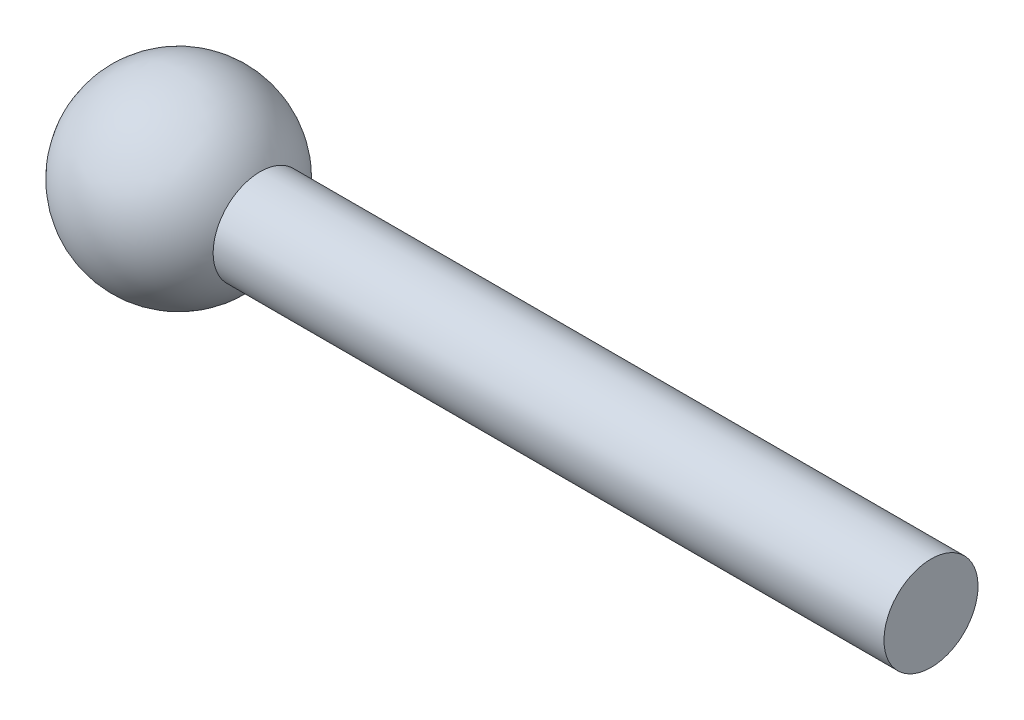
ISO-10303-21;
HEADER;
FILE_DESCRIPTION(('STEP AP214'),'2;1');
FILE_NAME('part.step','',(''),(''),'','','');
FILE_SCHEMA(('AUTOMOTIVE_DESIGN { 1 0 10303 214 1 1 1 1 }'));
ENDSEC;
DATA;
#1=APPLICATION_CONTEXT('core data for automotive mechanical design processes');
#2=APPLICATION_PROTOCOL_DEFINITION('international standard','automotive_design',2000,#1);
#3=PRODUCT_CONTEXT('',#1,'mechanical');
#4=PRODUCT('Part','Part','',(#3));
#5=PRODUCT_RELATED_PRODUCT_CATEGORY('part','',(#4));
#6=PRODUCT_DEFINITION_FORMATION('','',#4);
#7=PRODUCT_DEFINITION_CONTEXT('part definition',#1,'design');
#8=PRODUCT_DEFINITION('design','',#6,#7);
#9=PRODUCT_DEFINITION_SHAPE('','',#8);
#10=(LENGTH_UNIT() NAMED_UNIT(*) SI_UNIT(.MILLI.,.METRE.));
#11=(NAMED_UNIT(*) PLANE_ANGLE_UNIT() SI_UNIT($,.RADIAN.));
#12=(NAMED_UNIT(*) SI_UNIT($,.STERADIAN.) SOLID_ANGLE_UNIT());
#13=UNCERTAINTY_MEASURE_WITH_UNIT(LENGTH_MEASURE(1.E-05),#10,'distance_accuracy_value','');
#14=(GEOMETRIC_REPRESENTATION_CONTEXT(3) GLOBAL_UNCERTAINTY_ASSIGNED_CONTEXT((#13)) GLOBAL_UNIT_ASSIGNED_CONTEXT((#10,
#11,#12)) REPRESENTATION_CONTEXT('',''));
#15=CARTESIAN_POINT('',(0.,0.,0.));
#16=DIRECTION('',(0.,0.,1.));
#17=DIRECTION('',(1.,0.,0.));
#18=AXIS2_PLACEMENT_3D('',#15,#16,#17);
#19=CARTESIAN_POINT('',(0.,0.,0.));
#20=DIRECTION('',(-1.,0.,0.));
#21=DIRECTION('',(0.,-1.,0.));
#22=AXIS2_PLACEMENT_3D('',#19,#20,#21);
#23=PLANE('',#22);
#24=CARTESIAN_POINT('',(0.,-3.175,0.));
#25=DIRECTION('',(-1.,0.,0.));
#26=DIRECTION('',(0.,-1.,0.));
#27=AXIS2_PLACEMENT_3D('',#24,#25,#26);
#28=CIRCLE('',#27,3.175);
#29=CARTESIAN_POINT('',(0.,-6.35,0.));
#30=VERTEX_POINT('',#29);
#31=EDGE_CURVE('E10',#30,#30,#28,.T.);
#32=ORIENTED_EDGE('',*,*,#31,.F.);
#33=EDGE_LOOP('',(#32));
#34=FACE_BOUND('',#33,.T.);
#35=ADVANCED_FACE('F31',(#34),#23,.F.);
#36=CARTESIAN_POINT('',(-57.15,-3.17500000000001,0.));
#37=DIRECTION('',(-1.,0.,0.));
#38=DIRECTION('',(0.,-1.,0.));
#39=AXIS2_PLACEMENT_3D('',#36,#37,#38);
#40=CYLINDRICAL_SURFACE('',#39,3.175);
#41=CARTESIAN_POINT('',(-45.3007386859688,-3.175,0.));
#42=DIRECTION('',(-1.,0.,0.));
#43=DIRECTION('',(0.,-1.,0.));
#44=AXIS2_PLACEMENT_3D('',#41,#42,#43);
#45=CIRCLE('',#44,3.175);
#46=CARTESIAN_POINT('',(-45.3007386859688,-6.35,0.));
#47=VERTEX_POINT('',#46);
#48=EDGE_CURVE('E37',#47,#47,#45,.T.);
#49=ORIENTED_EDGE('',*,*,#48,.F.);
#50=EDGE_LOOP('',(#49));
#51=FACE_BOUND('',#50,.T.);
#52=ORIENTED_EDGE('',*,*,#31,.T.);
#53=EDGE_LOOP('',(#52));
#54=FACE_BOUND('',#53,.T.);
#55=ADVANCED_FACE('F45',(#51,#54),#40,.T.);
#56=CARTESIAN_POINT('',(-50.8,-3.17500000000001,0.));
#57=DIRECTION('',(-1.,0.,0.));
#58=DIRECTION('',(0.,1.,0.));
#59=AXIS2_PLACEMENT_3D('',#56,#57,#58);
#60=SPHERICAL_SURFACE('',#59,6.35);
#61=ORIENTED_EDGE('',*,*,#48,.T.);
#62=EDGE_LOOP('',(#61));
#63=FACE_BOUND('',#62,.T.);
#64=ADVANCED_FACE('F43',(#63),#60,.T.);
#65=CLOSED_SHELL('',(#35,#55,#64));
#66=MANIFOLD_SOLID_BREP('B2',#65);
#67=ADVANCED_BREP_SHAPE_REPRESENTATION('',(#18,#66),#14);
#68=SHAPE_DEFINITION_REPRESENTATION(#9,#67);
ENDSEC;
END-ISO-10303-21;
